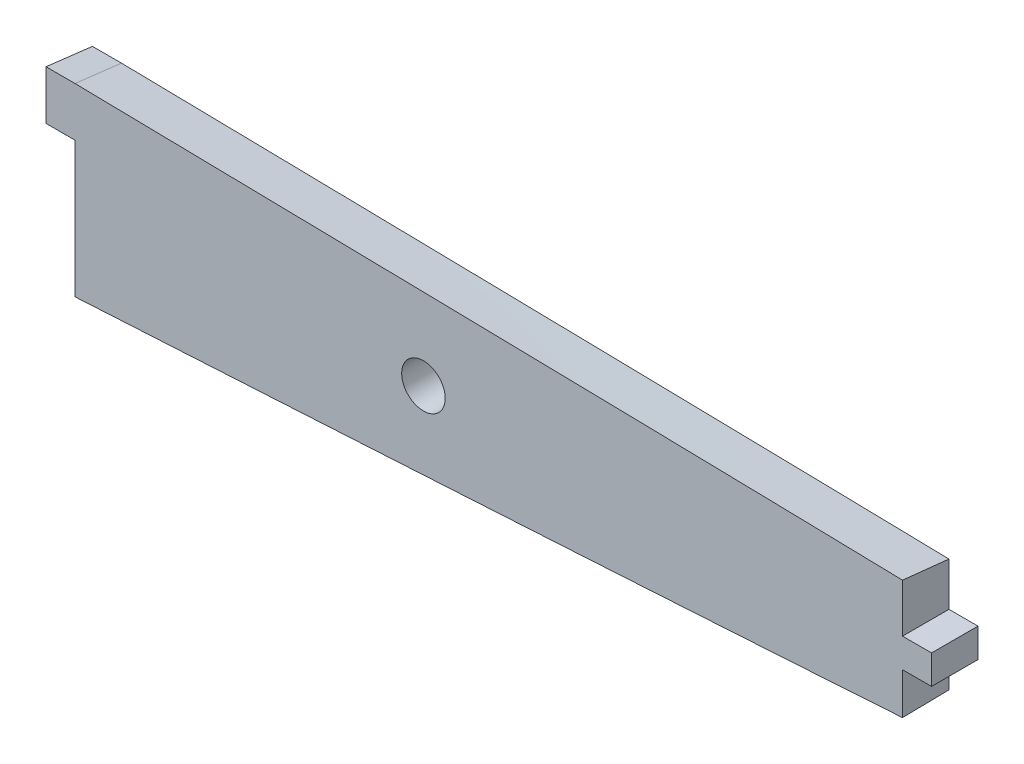
ISO-10303-21;
HEADER;
FILE_DESCRIPTION(('STEP AP214'),'2;1');
FILE_NAME('part.step','',(''),(''),'','','');
FILE_SCHEMA(('AUTOMOTIVE_DESIGN { 1 0 10303 214 1 1 1 1 }'));
ENDSEC;
DATA;
#1=APPLICATION_CONTEXT('core data for automotive mechanical design processes');
#2=APPLICATION_PROTOCOL_DEFINITION('international standard','automotive_design',2000,#1);
#3=PRODUCT_CONTEXT('',#1,'mechanical');
#4=PRODUCT('Part','Part','',(#3));
#5=PRODUCT_RELATED_PRODUCT_CATEGORY('part','',(#4));
#6=PRODUCT_DEFINITION_FORMATION('','',#4);
#7=PRODUCT_DEFINITION_CONTEXT('part definition',#1,'design');
#8=PRODUCT_DEFINITION('design','',#6,#7);
#9=PRODUCT_DEFINITION_SHAPE('','',#8);
#10=(LENGTH_UNIT() NAMED_UNIT(*) SI_UNIT(.MILLI.,.METRE.));
#11=(NAMED_UNIT(*) PLANE_ANGLE_UNIT() SI_UNIT($,.RADIAN.));
#12=(NAMED_UNIT(*) SI_UNIT($,.STERADIAN.) SOLID_ANGLE_UNIT());
#13=UNCERTAINTY_MEASURE_WITH_UNIT(LENGTH_MEASURE(1.E-05),#10,'distance_accuracy_value','');
#14=(GEOMETRIC_REPRESENTATION_CONTEXT(3) GLOBAL_UNCERTAINTY_ASSIGNED_CONTEXT((#13)) GLOBAL_UNIT_ASSIGNED_CONTEXT((#10,
#11,#12)) REPRESENTATION_CONTEXT('',''));
#15=CARTESIAN_POINT('',(0.,0.,0.));
#16=DIRECTION('',(0.,0.,1.));
#17=DIRECTION('',(1.,0.,0.));
#18=AXIS2_PLACEMENT_3D('',#15,#16,#17);
#19=CARTESIAN_POINT('',(0.,68.1685296686,5.08000000000001));
#20=DIRECTION('',(1.,0.,0.));
#21=DIRECTION('',(0.,0.,-1.));
#22=AXIS2_PLACEMENT_3D('',#19,#20,#21);
#23=PLANE('',#22);
#24=DIRECTION('',(0.,0.,1.));
#25=VECTOR('',#24,1.);
#26=CARTESIAN_POINT('',(0.,20.3824593467357,-5.07999999999997));
#27=LINE('',#26,#25);
#28=CARTESIAN_POINT('',(0.,20.3824593467356,-5.07999999999997));
#29=VERTEX_POINT('',#28);
#30=CARTESIAN_POINT('',(0.,20.3824593467355,5.07999999999986));
#31=VERTEX_POINT('',#30);
#32=EDGE_CURVE('E57',#29,#31,#27,.T.);
#33=ORIENTED_EDGE('',*,*,#32,.F.);
#34=DIRECTION('',(0.,-1.,0.));
#35=VECTOR('',#34,1.);
#36=CARTESIAN_POINT('',(0.,68.1685296686,-5.07999999999997));
#37=LINE('',#36,#35);
#38=CARTESIAN_POINT('',(0.,-8.9091186061851,-5.07999999999999));
#39=VERTEX_POINT('',#38);
#40=EDGE_CURVE('E130',#29,#39,#37,.T.);
#41=ORIENTED_EDGE('',*,*,#40,.T.);
#42=CARTESIAN_POINT('',(0.,-8.9091186061851,-5.08000000000001));
#43=CARTESIAN_POINT('',(0.,-9.100340278425,0.00828875850543073));
#44=CARTESIAN_POINT('',(0.,-9.28323172304783,5.07999999999983));
#45=B_SPLINE_CURVE_WITH_KNOTS('',2,(#42,#43,#44),.UNSPECIFIED.,.F.,.F.,(3,3),(0.,1.),.UNSPECIFIED.);
#46=CARTESIAN_POINT('',(0.,-9.28323172304783,5.07999999999992));
#47=VERTEX_POINT('',#46);
#48=EDGE_CURVE('E125',#39,#47,#45,.T.);
#49=ORIENTED_EDGE('',*,*,#48,.T.);
#50=DIRECTION('',(0.,-1.,0.));
#51=VECTOR('',#50,1.);
#52=CARTESIAN_POINT('',(0.,68.1685296686,5.08000000000001));
#53=LINE('',#52,#51);
#54=EDGE_CURVE('E122',#31,#47,#53,.T.);
#55=ORIENTED_EDGE('',*,*,#54,.F.);
#56=EDGE_LOOP('',(#33,#41,#49,#55));
#57=FACE_BOUND('',#56,.T.);
#58=ADVANCED_FACE('F36',(#57),#23,.F.);
#59=CARTESIAN_POINT('',(180.975,68.1685296686,5.08000000000006));
#60=DIRECTION('',(-1.,0.,0.));
#61=DIRECTION('',(0.,0.,1.));
#62=AXIS2_PLACEMENT_3D('',#59,#60,#61);
#63=PLANE('',#62);
#64=DIRECTION('',(0.,0.,1.));
#65=VECTOR('',#64,1.);
#66=CARTESIAN_POINT('',(180.975,16.9384284163652,5.07999999999863));
#67=LINE('',#66,#65);
#68=CARTESIAN_POINT('',(180.975,16.9384284163648,-5.08000000000006));
#69=VERTEX_POINT('',#68);
#70=CARTESIAN_POINT('',(180.975,16.9384284163648,5.08000000000006));
#71=VERTEX_POINT('',#70);
#72=EDGE_CURVE('E65',#69,#71,#67,.T.);
#73=ORIENTED_EDGE('',*,*,#72,.F.);
#74=DIRECTION('',(0.,-1.,0.));
#75=VECTOR('',#74,1.);
#76=CARTESIAN_POINT('',(180.975,68.1685296686,-5.08000000000006));
#77=LINE('',#76,#75);
#78=CARTESIAN_POINT('',(180.975,26.4634284163438,-5.08000000000006));
#79=VERTEX_POINT('',#78);
#80=EDGE_CURVE('E223',#79,#69,#77,.T.);
#81=ORIENTED_EDGE('',*,*,#80,.F.);
#82=CARTESIAN_POINT('',(180.975,27.5457610045795,5.08000000000007));
#83=CARTESIAN_POINT('',(180.975,27.4553730032048,4.23335396970068));
#84=CARTESIAN_POINT('',(180.975,27.3650457787327,3.38670145335956));
#85=CARTESIAN_POINT('',(180.975,27.1844942933383,1.69338545022722));
#86=CARTESIAN_POINT('',(180.975,27.0942700324148,0.846721963436123));
#87=CARTESIAN_POINT('',(180.975,26.9139058821622,-0.846613994891505));
#88=CARTESIAN_POINT('',(180.975,26.8237659928328,-1.69328646642802));
#89=CARTESIAN_POINT('',(180.975,26.6435522555936,-3.38663844667215));
#90=CARTESIAN_POINT('',(180.975,26.5534784076844,-4.23331795537983));
#91=CARTESIAN_POINT('',(180.975,26.4634284163438,-5.08000000000006));
#92=B_SPLINE_CURVE_WITH_KNOTS('',3,(#82,#83,#84,#85,#86,#87,#88,#89,#90,#91),.UNSPECIFIED.,.F.,
.F.,(4,2,2,2,4),(0.,2.55437181973439,5.10874361405029,7.66311540558675,10.2174872225417),.UNSPECIFIED.);
#93=CARTESIAN_POINT('',(180.975,27.5457610045795,5.08000000000006));
#94=VERTEX_POINT('',#93);
#95=EDGE_CURVE('E49',#94,#79,#92,.T.);
#96=ORIENTED_EDGE('',*,*,#95,.F.);
#97=DIRECTION('',(0.,-1.,0.));
#98=VECTOR('',#97,1.);
#99=CARTESIAN_POINT('',(180.975,68.1685296686,5.08000000000006));
#100=LINE('',#99,#98);
#101=EDGE_CURVE('E239',#94,#71,#100,.T.);
#102=ORIENTED_EDGE('',*,*,#101,.T.);
#103=EDGE_LOOP('',(#73,#81,#96,#102));
#104=FACE_BOUND('',#103,.T.);
#105=ADVANCED_FACE('F204',(#104),#63,.F.);
#106=DIRECTION('',(0.,0.,-1.));
#107=VECTOR('',#106,1.);
#108=CARTESIAN_POINT('',(180.975,10.5884284163652,5.07999999999921));
#109=LINE('',#108,#107);
#110=CARTESIAN_POINT('',(180.975,10.5884284163648,5.08000000000006));
#111=VERTEX_POINT('',#110);
#112=CARTESIAN_POINT('',(180.975,10.5884284163643,-5.08000000000083));
#113=VERTEX_POINT('',#112);
#114=EDGE_CURVE('E249',#111,#113,#109,.T.);
#115=ORIENTED_EDGE('',*,*,#114,.F.);
#116=CARTESIAN_POINT('',(180.975,1.50268763523809,5.08000000000005));
#117=VERTEX_POINT('',#116);
#118=EDGE_CURVE('E129',#111,#117,#100,.T.);
#119=ORIENTED_EDGE('',*,*,#118,.T.);
#120=CARTESIAN_POINT('',(180.975,1.67767318342592,-5.08000000000005));
#121=CARTESIAN_POINT('',(180.975,1.64653132812233,-3.38670072679886));
#122=CARTESIAN_POINT('',(180.975,1.61637827145488,-1.6933844235316));
#123=CARTESIAN_POINT('',(180.975,1.55804975539227,1.6932822431351));
#124=CARTESIAN_POINT('',(180.975,1.52987429599711,3.38663260653453));
#125=CARTESIAN_POINT('',(180.975,1.5026876352381,5.08000000000004));
#126=B_SPLINE_CURVE_WITH_KNOTS('',3,(#120,#121,#122,#123,#124,#125),.UNSPECIFIED.,.F.,.F.,(4,2,
4),(0.,5.08075425381252,10.161508507625),.UNSPECIFIED.);
#127=CARTESIAN_POINT('',(180.975,1.67767318342591,-5.08000000000005));
#128=VERTEX_POINT('',#127);
#129=EDGE_CURVE('E224',#128,#117,#126,.T.);
#130=ORIENTED_EDGE('',*,*,#129,.F.);
#131=EDGE_CURVE('E240',#113,#128,#77,.T.);
#132=ORIENTED_EDGE('',*,*,#131,.F.);
#133=EDGE_LOOP('',(#115,#119,#130,#132));
#134=FACE_BOUND('',#133,.T.);
#135=ADVANCED_FACE('F209',(#134),#63,.F.);
#136=CARTESIAN_POINT('',(0.,68.1685296686,5.08000000000001));
#137=DIRECTION('',(0.,0.,-1.));
#138=DIRECTION('',(-1.,0.,0.));
#139=AXIS2_PLACEMENT_3D('',#136,#137,#138);
#140=PLANE('',#139);
#141=CARTESIAN_POINT('',(76.2,11.9606935699889,5.08000000000003));
#142=DIRECTION('',(0.,0.,-1.));
#143=DIRECTION('',(-1.,0.,0.));
#144=AXIS2_PLACEMENT_3D('',#141,#142,#143);
#145=CIRCLE('',#144,4.76250000000001);
#146=CARTESIAN_POINT('',(71.4375,11.9606935699889,5.08000000000003));
#147=VERTEX_POINT('',#146);
#148=EDGE_CURVE('E146',#147,#147,#145,.F.);
#149=ORIENTED_EDGE('',*,*,#148,.F.);
#150=EDGE_LOOP('',(#149));
#151=FACE_BOUND('',#150,.T.);
#152=CARTESIAN_POINT('',(0.,31.1264588411048,5.08000000000002));
#153=CARTESIAN_POINT('',(7.540878598146,30.9915007529378,5.08000000000001));
#154=CARTESIAN_POINT('',(15.081745282566,30.8558698048851,5.08000000000001));
#155=CARTESIAN_POINT('',(30.1634467129071,30.5826941103659,5.08000000000003));
#156=CARTESIAN_POINT('',(37.7042814588156,30.4451493632016,5.08000000000004));
#157=CARTESIAN_POINT('',(52.7859055300961,30.1675780870469,5.08000000000003));
#158=CARTESIAN_POINT('',(60.3266948554674,30.0275515580145,5.08000000000002));
#159=CARTESIAN_POINT('',(71.637831258098,29.8150365208587,5.08000000000003));
#160=CARTESIAN_POINT('',(75.4082015924928,29.7437856448358,5.08000000000004));
#161=CARTESIAN_POINT('',(82.9489244022193,29.600330419434,5.08000000000002));
#162=CARTESIAN_POINT('',(86.7192768775498,29.5281260699865,5.08));
#163=CARTESIAN_POINT('',(95.516767514312,29.3583681854645,5.08));
#164=CARTESIAN_POINT('',(100.543897453606,29.2603877856525,5.08000000000003));
#165=CARTESIAN_POINT('',(110.598110561089,29.0620619339715,5.08000000000005));
#166=CARTESIAN_POINT('',(115.625193729279,28.9617164821885,5.08000000000004));
#167=CARTESIAN_POINT('',(125.679300891383,28.7581477626605,5.08000000000004));
#168=CARTESIAN_POINT('',(130.706324885308,28.6549244955037,5.08000000000006));
#169=CARTESIAN_POINT('',(140.760307894703,28.4449589930916,5.08000000000003));
#170=CARTESIAN_POINT('',(145.787266910051,28.3382167519671,5.07999999999999));
#171=CARTESIAN_POINT('',(155.84109255585,28.1204062016917,5.08000000000011));
#172=CARTESIAN_POINT('',(160.867959186284,28.0093378917542,5.08000000000027));
#173=CARTESIAN_POINT('',(170.92157553666,27.781834581265,5.07999999999984));
#174=CARTESIAN_POINT('',(175.948325256487,27.6653995756793,5.07999999999925));
#175=CARTESIAN_POINT('',(180.975,27.5457610045794,5.0799999999978));
#176=B_SPLINE_CURVE_WITH_KNOTS('',3,(#152,#153,#154,#155,#156,#157,#158,#159,#160,#161,#162,
#163,#164,#165,#166,#167,#168,#169,#170,#171,#172,#173,#174,#175),.UNSPECIFIED.,.F.,.F.,(4,2,2,
2,2,2,2,2,2,2,2,4),(0.,22.6262586494779,45.2525255484199,67.8787928307882,79.1919232579126,
90.5050544986673,105.589308081419,120.673561116489,135.757811068393,150.842086180281,
165.926364035267,181.010656039493),.UNSPECIFIED.);
#177=CARTESIAN_POINT('',(0.,31.1264588411048,5.08000000000002));
#178=VERTEX_POINT('',#177);
#179=EDGE_CURVE('E199',#178,#94,#176,.T.);
#180=ORIENTED_EDGE('',*,*,#179,.F.);
#181=DIRECTION('',(1.,0.,0.));
#182=VECTOR('',#181,1.);
#183=CARTESIAN_POINT('',(-21.1371270074686,31.1264588411048,5.08000000000002));
#184=LINE('',#183,#182);
#185=CARTESIAN_POINT('',(-6.35,31.1264588411048,5.08000000000002));
#186=VERTEX_POINT('',#185);
#187=EDGE_CURVE('E141',#186,#178,#184,.T.);
#188=ORIENTED_EDGE('',*,*,#187,.F.);
#189=DIRECTION('',(0.,-1.,0.));
#190=VECTOR('',#189,1.);
#191=CARTESIAN_POINT('',(-6.35,20.3824593467355,5.07999999999986));
#192=LINE('',#191,#190);
#193=CARTESIAN_POINT('',(-6.35,20.3824593467355,5.07999999999986));
#194=VERTEX_POINT('',#193);
#195=EDGE_CURVE('E137',#186,#194,#192,.T.);
#196=ORIENTED_EDGE('',*,*,#195,.T.);
#197=DIRECTION('',(1.,0.,0.));
#198=VECTOR('',#197,1.);
#199=CARTESIAN_POINT('',(-21.1371270074686,20.3824593467355,5.07999999999986));
#200=LINE('',#199,#198);
#201=EDGE_CURVE('E134',#194,#31,#200,.T.);
#202=ORIENTED_EDGE('',*,*,#201,.T.);
#203=ORIENTED_EDGE('',*,*,#54,.T.);
#204=CARTESIAN_POINT('',(0.,-9.28323172304784,5.08000000000001));
#205=CARTESIAN_POINT('',(7.54204521171787,-8.85911107441002,5.08000000000004));
#206=CARTESIAN_POINT('',(15.0839979535319,-8.43333860801259,5.08000000000003));
#207=CARTESIAN_POINT('',(30.1676750102591,-7.57765754531917,5.08));
#208=CARTESIAN_POINT('',(37.7093993249771,-7.1477489455862,5.07999999999998));
#209=CARTESIAN_POINT('',(52.7925639955184,-6.28296379586194,5.07999999999998));
#210=CARTESIAN_POINT('',(60.3340043513232,-5.84808724554745,5.08000000000002));
#211=CARTESIAN_POINT('',(71.6458965346627,-5.19119198938416,5.08000000000004));
#212=CARTESIAN_POINT('',(75.4164814070682,-4.97146356543832,5.08000000000004));
#213=CARTESIAN_POINT('',(82.9575522598697,-4.53030672419307,5.08000000000003));
#214=CARTESIAN_POINT('',(86.7280382402518,-4.30887830665409,5.08000000000001));
#215=CARTESIAN_POINT('',(95.5257872214362,-3.79000103858775,5.08000000000001));
#216=CARTESIAN_POINT('',(100.553006880389,-3.49181668966135,5.08000000000003));
#217=CARTESIAN_POINT('',(110.607213553098,-2.89155279527505,5.08000000000005));
#218=CARTESIAN_POINT('',(115.634200566864,-2.58947324998636,5.08000000000004));
#219=CARTESIAN_POINT('',(125.687898655516,-1.98078187839749,5.08000000000004));
#220=CARTESIAN_POINT('',(130.714609730498,-1.67417005368462,5.08000000000005));
#221=CARTESIAN_POINT('',(140.767724732615,-1.05565133700586,5.08000000000004));
#222=CARTESIAN_POINT('',(145.794128658562,-0.743744425730248,5.08000000000002));
#223=CARTESIAN_POINT('',(155.846551133154,-0.113744507681252,5.08000000000008));
#224=CARTESIAN_POINT('',(160.872569681669,0.204348501163069,5.08000000000017));
#225=CARTESIAN_POINT('',(170.9241494129,0.847799660625839,5.07999999999994));
#226=CARTESIAN_POINT('',(175.949710594881,1.17315782272172,5.07999999999962));
#227=CARTESIAN_POINT('',(180.975,1.50268763523811,5.07999999999884));
#228=B_SPLINE_CURVE_WITH_KNOTS('',3,(#204,#205,#206,#207,#208,#209,#210,#211,#212,#213,#214,
#215,#216,#217,#218,#219,#220,#221,#222,#223,#224,#225,#226,#227),.UNSPECIFIED.,.F.,.F.,(4,2,2,
2,2,2,2,2,2,2,2,4),(0.,22.6618829207635,45.3237846743184,67.9856879022546,79.316632722599,
90.6475791396908,105.755743234119,120.863906664476,135.972064803741,151.080278050144,
166.188496354463,181.296738528319),.UNSPECIFIED.);
#229=EDGE_CURVE('E255',#47,#117,#228,.T.);
#230=ORIENTED_EDGE('',*,*,#229,.T.);
#231=ORIENTED_EDGE('',*,*,#118,.F.);
#232=DIRECTION('',(-1.,0.,0.));
#233=VECTOR('',#232,1.);
#234=CARTESIAN_POINT('',(199.306156037713,10.5884284163652,5.07999999999921));
#235=LINE('',#234,#233);
#236=CARTESIAN_POINT('',(187.325,10.5884284163652,5.07999999999921));
#237=VERTEX_POINT('',#236);
#238=EDGE_CURVE('E440',#237,#111,#235,.T.);
#239=ORIENTED_EDGE('',*,*,#238,.F.);
#240=DIRECTION('',(0.,-1.,0.));
#241=VECTOR('',#240,1.);
#242=CARTESIAN_POINT('',(187.325,16.9384284163652,5.07999999999863));
#243=LINE('',#242,#241);
#244=CARTESIAN_POINT('',(187.325,16.9384284163652,5.07999999999863));
#245=VERTEX_POINT('',#244);
#246=EDGE_CURVE('E456',#245,#237,#243,.T.);
#247=ORIENTED_EDGE('',*,*,#246,.F.);
#248=DIRECTION('',(-1.,0.,0.));
#249=VECTOR('',#248,1.);
#250=CARTESIAN_POINT('',(199.306156037713,16.9384284163652,5.07999999999863));
#251=LINE('',#250,#249);
#252=EDGE_CURVE('E435',#245,#71,#251,.T.);
#253=ORIENTED_EDGE('',*,*,#252,.T.);
#254=ORIENTED_EDGE('',*,*,#101,.F.);
#255=EDGE_LOOP('',(#180,#188,#196,#202,#203,#230,#231,#239,#247,#253,#254));
#256=FACE_BOUND('',#255,.T.);
#257=ADVANCED_FACE('F135',(#151,#256),#140,.F.);
#258=CARTESIAN_POINT('',(0.,68.1685296686,-5.07999999999997));
#259=DIRECTION('',(0.,0.,1.));
#260=DIRECTION('',(1.,0.,0.));
#261=AXIS2_PLACEMENT_3D('',#258,#259,#260);
#262=PLANE('',#261);
#263=CARTESIAN_POINT('',(76.2,11.9606935699889,-5.08));
#264=DIRECTION('',(0.,0.,-1.));
#265=DIRECTION('',(-1.,0.,0.));
#266=AXIS2_PLACEMENT_3D('',#263,#264,#265);
#267=CIRCLE('',#266,4.76250000000001);
#268=CARTESIAN_POINT('',(71.4375,11.9606935699889,-5.08));
#269=VERTEX_POINT('',#268);
#270=EDGE_CURVE('E151',#269,#269,#267,.T.);
#271=ORIENTED_EDGE('',*,*,#270,.F.);
#272=EDGE_LOOP('',(#271));
#273=FACE_BOUND('',#272,.T.);
#274=CARTESIAN_POINT('',(180.975,26.4634284163438,-5.08000000000006));
#275=CARTESIAN_POINT('',(176.861288744215,26.5528301722815,-5.08000000000006));
#276=CARTESIAN_POINT('',(172.747545793579,26.6407599051557,-5.08000000000005));
#277=CARTESIAN_POINT('',(164.520007188514,26.8140969797346,-5.08000000000005));
#278=CARTESIAN_POINT('',(160.406211534091,26.8995043217341,-5.08000000000004));
#279=CARTESIAN_POINT('',(152.178579347824,27.0682182471171,-5.08000000000004));
#280=CARTESIAN_POINT('',(148.064742816003,27.151524831574,-5.08000000000005));
#281=CARTESIAN_POINT('',(139.837034063824,27.3163614696467,-5.08000000000003));
#282=CARTESIAN_POINT('',(135.723161843465,27.397891523203,-5.08000000000001));
#283=CARTESIAN_POINT('',(123.381505515301,27.6402430379542,-5.07999999999998));
#284=CARTESIAN_POINT('',(115.153677455265,27.7988259404883,-5.08));
#285=CARTESIAN_POINT('',(98.6979380209043,28.1117098225093,-5.08000000000004));
#286=CARTESIAN_POINT('',(90.4700266465566,28.2660108008205,-5.08000000000005));
#287=CARTESIAN_POINT('',(75.3886347910034,28.545978357519,-5.08000000000004));
#288=CARTESIAN_POINT('',(68.5351631578599,28.6721224038424,-5.08000000000001));
#289=CARTESIAN_POINT('',(54.8281893168122,28.9227415474247,-5.07999999999998));
#290=CARTESIAN_POINT('',(47.9746871089077,29.0472166446614,-5.07999999999999));
#291=CARTESIAN_POINT('',(34.2676640365372,29.2948830815499,-5.07999999999999));
#292=CARTESIAN_POINT('',(27.4141431720866,29.4180744220467,-5.07999999999998));
#293=CARTESIAN_POINT('',(13.7070836797305,29.663451533301,-5.07999999999997));
#294=CARTESIAN_POINT('',(6.85354505182572,29.7856373040944,-5.07999999999997));
#295=CARTESIAN_POINT('',(0.,29.9074593467357,-5.07999999999996));
#296=B_SPLINE_CURVE_WITH_KNOTS('',3,(#274,#275,#276,#277,#278,#279,#280,#281,#282,#283,#284,
#285,#286,#287,#288,#289,#290,#291,#292,#293,#294,#295),.UNSPECIFIED.,.F.,.F.,(4,2,2,2,2,2,2,2,
2,2,4),(0.,12.3440471339799,24.6880928257615,37.032132211091,49.3761720098245,74.0642387492005,
98.7523122667729,119.316209304779,139.880106614286,160.443990387034,181.007873426194),.UNSPECIFIED.);
#297=CARTESIAN_POINT('',(0.,29.9074593467357,-5.07999999999997));
#298=VERTEX_POINT('',#297);
#299=EDGE_CURVE('E11',#79,#298,#296,.T.);
#300=ORIENTED_EDGE('',*,*,#299,.F.);
#301=ORIENTED_EDGE('',*,*,#80,.T.);
#302=DIRECTION('',(-1.,0.,0.));
#303=VECTOR('',#302,1.);
#304=CARTESIAN_POINT('',(199.306156037713,16.9384284163643,-5.08000000000139));
#305=LINE('',#304,#303);
#306=CARTESIAN_POINT('',(187.325,16.9384284163643,-5.08000000000139));
#307=VERTEX_POINT('',#306);
#308=EDGE_CURVE('E176',#307,#69,#305,.T.);
#309=ORIENTED_EDGE('',*,*,#308,.F.);
#310=DIRECTION('',(0.,1.,0.));
#311=VECTOR('',#310,1.);
#312=CARTESIAN_POINT('',(187.325,10.5884284163643,-5.08000000000083));
#313=LINE('',#312,#311);
#314=CARTESIAN_POINT('',(187.325,10.5884284163643,-5.08000000000083));
#315=VERTEX_POINT('',#314);
#316=EDGE_CURVE('E258',#315,#307,#313,.T.);
#317=ORIENTED_EDGE('',*,*,#316,.F.);
#318=DIRECTION('',(-1.,0.,0.));
#319=VECTOR('',#318,1.);
#320=CARTESIAN_POINT('',(199.306156037713,10.5884284163643,-5.08000000000083));
#321=LINE('',#320,#319);
#322=EDGE_CURVE('E181',#315,#113,#321,.T.);
#323=ORIENTED_EDGE('',*,*,#322,.T.);
#324=ORIENTED_EDGE('',*,*,#131,.T.);
#325=CARTESIAN_POINT('',(180.975,1.67767318342592,-5.08000000000005));
#326=CARTESIAN_POINT('',(175.949540454974,1.35735073760627,-5.08000000000005));
#327=CARTESIAN_POINT('',(170.923841051549,1.04081616620861,-5.08000000000005));
#328=CARTESIAN_POINT('',(160.872042758774,0.414256340321322,-5.08000000000005));
#329=CARTESIAN_POINT('',(155.845943869947,0.104231077457531,-5.08000000000004));
#330=CARTESIAN_POINT('',(145.793415230545,-0.51037730103878,-5.08000000000004));
#331=CARTESIAN_POINT('',(140.766985480058,-0.814960418105779,-5.08000000000004));
#332=CARTESIAN_POINT('',(130.713862990683,-1.4195177331825,-5.08000000000003));
#333=CARTESIAN_POINT('',(125.687170252564,-1.71949194397887,-5.08000000000003));
#334=CARTESIAN_POINT('',(115.633551757485,-2.31553104095315,-5.08000000000002));
#335=CARTESIAN_POINT('',(110.60662600046,-2.61159592602057,-5.08000000000001));
#336=CARTESIAN_POINT('',(100.552578966955,-3.20038872464224,-5.08000000000003));
#337=CARTESIAN_POINT('',(95.5254576904676,-3.49311663806639,-5.08000000000005));
#338=CARTESIAN_POINT('',(86.7277787466528,-4.00288819136693,-5.08000000000004));
#339=CARTESIAN_POINT('',(82.9572573585865,-4.22055841143872,-5.08000000000002));
#340=CARTESIAN_POINT('',(75.4161319548203,-4.65445517924708,-5.07999999999999));
#341=CARTESIAN_POINT('',(71.6455279391295,-4.87068172714357,-5.08));
#342=CARTESIAN_POINT('',(60.333601540833,-5.51742266902181,-5.08000000000001));
#343=CARTESIAN_POINT('',(52.7921682736793,-5.94599816060606,-5.08000000000002));
#344=CARTESIAN_POINT('',(37.709053567068,-6.79896470257326,-5.08000000000001));
#345=CARTESIAN_POINT('',(30.1673721272412,-7.22335574642069,-5.07999999999998));
#346=CARTESIAN_POINT('',(15.0838192931408,-8.06866429717433,-5.07999999999997));
#347=CARTESIAN_POINT('',(7.54194789898976,-8.48958180626742,-5.07999999999998));
#348=CARTESIAN_POINT('',(0.,-8.90911860618509,-5.08000000000005));
#349=B_SPLINE_CURVE_WITH_KNOTS('',3,(#325,#326,#327,#328,#329,#330,#331,#332,#333,#334,#335,
#336,#337,#338,#339,#340,#341,#342,#343,#344,#345,#346,#347,#348),.UNSPECIFIED.,.F.,.F.,(4,2,2,
2,2,2,2,2,2,2,2,4),(0.,15.1069698766817,30.2139203172093,45.3208667756819,60.4277713148731,
75.5346801453313,90.6415895648131,101.971986747143,113.302382674256,135.963184945905,
158.624022604903,181.284845996009),.UNSPECIFIED.);
#350=EDGE_CURVE('E257',#128,#39,#349,.T.);
#351=ORIENTED_EDGE('',*,*,#350,.T.);
#352=ORIENTED_EDGE('',*,*,#40,.F.);
#353=DIRECTION('',(1.,0.,0.));
#354=VECTOR('',#353,1.);
#355=CARTESIAN_POINT('',(-21.1371270074686,20.3824593467357,-5.07999999999997));
#356=LINE('',#355,#354);
#357=CARTESIAN_POINT('',(-6.35,20.3824593467357,-5.07999999999997));
#358=VERTEX_POINT('',#357);
#359=EDGE_CURVE('E140',#358,#29,#356,.T.);
#360=ORIENTED_EDGE('',*,*,#359,.F.);
#361=DIRECTION('',(0.,1.,0.));
#362=VECTOR('',#361,1.);
#363=CARTESIAN_POINT('',(-6.35,29.9074593467357,-5.07999999999997));
#364=LINE('',#363,#362);
#365=CARTESIAN_POINT('',(-6.35,29.9074593467357,-5.07999999999997));
#366=VERTEX_POINT('',#365);
#367=EDGE_CURVE('E429',#358,#366,#364,.T.);
#368=ORIENTED_EDGE('',*,*,#367,.T.);
#369=DIRECTION('',(1.,0.,0.));
#370=VECTOR('',#369,1.);
#371=CARTESIAN_POINT('',(-21.1371270074686,29.9074593467357,-5.07999999999997));
#372=LINE('',#371,#370);
#373=EDGE_CURVE('E163',#366,#298,#372,.T.);
#374=ORIENTED_EDGE('',*,*,#373,.T.);
#375=EDGE_LOOP('',(#300,#301,#309,#317,#323,#324,#351,#352,#360,#368,#374));
#376=FACE_BOUND('',#375,.T.);
#377=ADVANCED_FACE('F210',(#273,#376),#262,.F.);
#378=CARTESIAN_POINT('',(0.,3.76640621989611,-241.3));
#379=CARTESIAN_POINT('',(180.975,8.69313035782715,-164.333003978403));
#380=CARTESIAN_POINT('',(0.,13.1710087068932,-169.512198054911));
#381=CARTESIAN_POINT('',(180.975,13.8921825252803,-119.662610613001));
#382=CARTESIAN_POINT('',(0.,21.0550575782133,-78.8082599981825));
#383=CARTESIAN_POINT('',(180.975,19.33371338101,-72.3769229623819));
#384=CARTESIAN_POINT('',(0.,37.1235261113863,55.6101587487718));
#385=CARTESIAN_POINT('',(180.975,28.6507060178125,15.6276355346142));
#386=CARTESIAN_POINT('',(0.,48.7977663222177,129.426856504391));
#387=CARTESIAN_POINT('',(180.975,33.9284348276645,64.5497023457835));
#388=CARTESIAN_POINT('',(0.,57.5998085231161,198.009320440341));
#389=CARTESIAN_POINT('',(180.975,38.0813427594087,95.1955572914661));
#390=CARTESIAN_POINT('',(0.,62.9543851616648,247.036281870022));
#391=CARTESIAN_POINT('',(180.975,40.072039815151,117.202001979545));
#392=CARTESIAN_POINT('',(0.,66.1525245092423,291.989522693939));
#393=CARTESIAN_POINT('',(180.975,41.1499185194115,137.241930839791));
#394=CARTESIAN_POINT('',(0.,68.1675296686,352.543352943217));
#395=CARTESIAN_POINT('',(180.975,43.3111951964629,164.012369139284));
#396=CARTESIAN_POINT('',(0.,67.7183696879014,410.109595972467));
#397=CARTESIAN_POINT('',(180.975,43.8548371209846,189.230485440772));
#398=CARTESIAN_POINT('',(0.,63.2094386266616,467.82184250888));
#399=CARTESIAN_POINT('',(180.975,40.1916457914026,215.197160236647));
#400=CARTESIAN_POINT('',(0.,57.956184881224,507.350823143271));
#401=CARTESIAN_POINT('',(180.975,36.7387215138955,233.332717966986));
#402=CARTESIAN_POINT('',(0.,54.7487461076087,526.308273351952));
#403=CARTESIAN_POINT('',(180.975,34.8156235896686,242.201701799802));
#404=CARTESIAN_POINT('',(0.,50.2039147105371,546.352546318645));
#405=CARTESIAN_POINT('',(180.975,32.6078504037563,251.794049093099));
#406=CARTESIAN_POINT('',(0.,44.0113074578187,566.914559376086));
#407=CARTESIAN_POINT('',(180.975,30.0023301395098,261.857755720266));
#408=CARTESIAN_POINT('',(0.,31.2937438611368,594.054164436425));
#409=CARTESIAN_POINT('',(180.975,23.0591377393112,275.21582052234));
#410=CARTESIAN_POINT('',(0.,19.9797534020256,609.754137799728));
#411=CARTESIAN_POINT('',(180.975,16.9218526728062,283.327395290058));
#412=CARTESIAN_POINT('',(0.,13.2914062198966,617.022547788667));
#413=CARTESIAN_POINT('',(180.975,13.2914062198966,287.066868946793));
#414=B_SPLINE_SURFACE_WITH_KNOTS('',3,1,((#378,#379),(#380,#381),(#382,#383),(#384,#385),(#386,
#387),(#388,#389),(#390,#391),(#392,#393),(#394,#395),(#396,#397),(#398,#399),(#400,#401),(#402,
#403),(#404,#405),(#406,#407),(#408,#409),(#410,#411),(#412,#413)),.UNSPECIFIED.,.F.,.F.,.F.,(4,
1,1,1,1,1,1,1,1,1,1,1,1,1,1,4),(2,2),(0.,0.247403676163197,0.308401542794999,0.462108507234246,
0.504395117820794,0.542913331738732,0.627983171442133,0.653401948280027,0.743134379497065,
0.818760812058344,0.850169972641487,0.882434425471212,0.887176210845698,0.924179621726545,
0.960505119713505,1.),(0.,1.),.UNSPECIFIED.);
#415=CARTESIAN_POINT('',(0.,31.1264588411048,5.08000000000003));
#416=CARTESIAN_POINT('',(0.,31.0234962481061,4.23349930580334));
#417=CARTESIAN_POINT('',(0.,30.9208895962421,3.38695533199301));
#418=CARTESIAN_POINT('',(0.,30.7163715506977,1.69378395349765));
#419=CARTESIAN_POINT('',(0.,30.6144601565709,0.847156548866551));
#420=CARTESIAN_POINT('',(0.,30.4113158710111,-0.846179643515562));
#421=CARTESIAN_POINT('',(0.,30.3100829795728,-1.69288843126593));
#422=CARTESIAN_POINT('',(0.,30.1082789761446,-3.38638542084281));
#423=CARTESIAN_POINT('',(0.,30.0077078645798,-4.23317362271998));
#424=CARTESIAN_POINT('',(0.,29.9074593467357,-5.07999999999996));
#425=B_SPLINE_CURVE_WITH_KNOTS('',3,(#415,#416,#417,#418,#419,#420,#421,#422,#423,#424),
.UNSPECIFIED.,.F.,.F.,(4,2,2,2,4),(0.,2.55821851976493,5.11643539656185,7.67465225309253,
10.2328707525912),.UNSPECIFIED.);
#426=EDGE_CURVE('E185',#178,#298,#425,.T.);
#427=ORIENTED_EDGE('',*,*,#426,.F.);
#428=ORIENTED_EDGE('',*,*,#179,.T.);
#429=ORIENTED_EDGE('',*,*,#95,.T.);
#430=ORIENTED_EDGE('',*,*,#299,.T.);
#431=EDGE_LOOP('',(#427,#428,#429,#430));
#432=FACE_BOUND('',#431,.T.);
#433=ADVANCED_FACE('F38',(#432),#414,.T.);
#434=CARTESIAN_POINT('',(0.,13.2914062198968,617.022547788667));
#435=CARTESIAN_POINT('',(180.975,13.2914062198967,287.066868946793));
#436=CARTESIAN_POINT('',(0.,-1.6346618460275,579.732083241401));
#437=CARTESIAN_POINT('',(180.975,7.90414132716936,266.665101534965));
#438=CARTESIAN_POINT('',(0.,-7.63985071848049,493.124189486326));
#439=CARTESIAN_POINT('',(180.975,0.681716153609975,218.41528803322));
#440=CARTESIAN_POINT('',(0.,-11.5456493437354,383.35644074039));
#441=CARTESIAN_POINT('',(180.975,0.694296632013353,161.799137472671));
#442=CARTESIAN_POINT('',(0.,-15.7692195959272,130.463845401109));
#443=CARTESIAN_POINT('',(180.975,0.769058525041147,31.7030236612414));
#444=CARTESIAN_POINT('',(0.,-8.62268129918264,-59.4070577204985));
#445=CARTESIAN_POINT('',(180.975,1.49966506495164,-70.1666512266198));
#446=CARTESIAN_POINT('',(0.,3.76640621989611,-241.3));
#447=CARTESIAN_POINT('',(180.975,8.69313035782715,-164.333003978403));
#448=B_SPLINE_SURFACE_WITH_KNOTS('',3,1,((#434,#435),(#436,#437),(#438,#439),(#440,#441),(#442,
#443),(#444,#445),(#446,#447)),.UNSPECIFIED.,.F.,.F.,.F.,(4,1,1,1,4),(2,2),(0.,
0.138221334267563,0.3235363097206,0.374686955614901,1.),(0.,1.),.UNSPECIFIED.);
#449=ORIENTED_EDGE('',*,*,#350,.F.);
#450=ORIENTED_EDGE('',*,*,#129,.T.);
#451=ORIENTED_EDGE('',*,*,#229,.F.);
#452=ORIENTED_EDGE('',*,*,#48,.F.);
#453=EDGE_LOOP('',(#449,#450,#451,#452));
#454=FACE_BOUND('',#453,.T.);
#455=ADVANCED_FACE('F254',(#454),#448,.T.);
#456=CARTESIAN_POINT('',(199.306156037713,10.5884284163652,5.07999999999921));
#457=DIRECTION('',(0.,1.,0.));
#458=DIRECTION('',(0.,0.,1.));
#459=AXIS2_PLACEMENT_3D('',#456,#457,#458);
#460=PLANE('',#459);
#461=DIRECTION('',(0.,0.,-1.));
#462=VECTOR('',#461,1.);
#463=CARTESIAN_POINT('',(187.325,10.5884284163652,5.07999999999921));
#464=LINE('',#463,#462);
#465=EDGE_CURVE('E458',#237,#315,#464,.T.);
#466=ORIENTED_EDGE('',*,*,#465,.F.);
#467=ORIENTED_EDGE('',*,*,#238,.T.);
#468=ORIENTED_EDGE('',*,*,#114,.T.);
#469=ORIENTED_EDGE('',*,*,#322,.F.);
#470=EDGE_LOOP('',(#466,#467,#468,#469));
#471=FACE_BOUND('',#470,.T.);
#472=ADVANCED_FACE('F279',(#471),#460,.F.);
#473=CARTESIAN_POINT('',(199.306156037713,16.9384284163652,5.07999999999863));
#474=DIRECTION('',(0.,-1.,0.));
#475=DIRECTION('',(0.,0.,-1.));
#476=AXIS2_PLACEMENT_3D('',#473,#474,#475);
#477=PLANE('',#476);
#478=DIRECTION('',(0.,0.,1.));
#479=VECTOR('',#478,1.);
#480=CARTESIAN_POINT('',(187.325,16.9384284163652,5.07999999999863));
#481=LINE('',#480,#479);
#482=EDGE_CURVE('E175',#307,#245,#481,.T.);
#483=ORIENTED_EDGE('',*,*,#482,.F.);
#484=ORIENTED_EDGE('',*,*,#308,.T.);
#485=ORIENTED_EDGE('',*,*,#72,.T.);
#486=ORIENTED_EDGE('',*,*,#252,.F.);
#487=EDGE_LOOP('',(#483,#484,#485,#486));
#488=FACE_BOUND('',#487,.T.);
#489=ADVANCED_FACE('F292',(#488),#477,.F.);
#490=CARTESIAN_POINT('',(187.325,0.900951429124184,61.6633497114729));
#491=DIRECTION('',(1.,0.,0.));
#492=DIRECTION('',(0.,0.,-1.));
#493=AXIS2_PLACEMENT_3D('',#490,#491,#492);
#494=PLANE('',#493);
#495=ORIENTED_EDGE('',*,*,#482,.T.);
#496=ORIENTED_EDGE('',*,*,#246,.T.);
#497=ORIENTED_EDGE('',*,*,#465,.T.);
#498=ORIENTED_EDGE('',*,*,#316,.T.);
#499=EDGE_LOOP('',(#495,#496,#497,#498));
#500=FACE_BOUND('',#499,.T.);
#501=ADVANCED_FACE('F280',(#500),#494,.T.);
#502=CARTESIAN_POINT('',(-21.1371270074686,20.3824593467357,-5.07999999999997));
#503=DIRECTION('',(0.,1.,0.));
#504=DIRECTION('',(0.,0.,1.));
#505=AXIS2_PLACEMENT_3D('',#502,#503,#504);
#506=PLANE('',#505);
#507=ORIENTED_EDGE('',*,*,#201,.F.);
#508=DIRECTION('',(0.,0.,-1.));
#509=VECTOR('',#508,1.);
#510=CARTESIAN_POINT('',(-6.35,20.3824593467357,-5.07999999999997));
#511=LINE('',#510,#509);
#512=EDGE_CURVE('E167',#194,#358,#511,.T.);
#513=ORIENTED_EDGE('',*,*,#512,.T.);
#514=ORIENTED_EDGE('',*,*,#359,.T.);
#515=ORIENTED_EDGE('',*,*,#32,.T.);
#516=EDGE_LOOP('',(#507,#513,#514,#515));
#517=FACE_BOUND('',#516,.T.);
#518=ADVANCED_FACE('F144',(#517),#506,.F.);
#519=CARTESIAN_POINT('',(-21.1371270074686,31.1264588411048,5.08000000000002));
#520=CARTESIAN_POINT('',(-21.1371270074686,30.7147534493723,1.6951893185686));
#521=CARTESIAN_POINT('',(-21.1371270074686,30.3085908353275,-1.69153354386451));
#522=CARTESIAN_POINT('',(-21.1371270074686,29.9074593467357,-5.07999999999997));
#523=B_SPLINE_CURVE_WITH_KNOTS('',3,(#519,#520,#521,#522),.UNSPECIFIED.,.F.,.F.,(4,4),
(0.269771877436496,0.281416192604098),.UNSPECIFIED.);
#524=DIRECTION('',(1.,0.,0.));
#525=VECTOR('',#524,1.);
#526=SURFACE_OF_LINEAR_EXTRUSION('',#523,#525);
#527=ORIENTED_EDGE('',*,*,#373,.F.);
#528=CARTESIAN_POINT('',(-6.35000000000002,31.1264588411048,5.08000000000002));
#529=CARTESIAN_POINT('',(-6.35000000000002,30.7147534493723,1.6951893185686));
#530=CARTESIAN_POINT('',(-6.35000000000002,30.3085908353275,-1.69153354386451));
#531=CARTESIAN_POINT('',(-6.35000000000002,29.9074593467357,-5.07999999999997));
#532=B_SPLINE_CURVE_WITH_KNOTS('',3,(#528,#529,#530,#531),.UNSPECIFIED.,.F.,.F.,(4,4),
(0.269771877436496,0.281416192604098),.UNSPECIFIED.);
#533=EDGE_CURVE('E431',#366,#186,#532,.F.);
#534=ORIENTED_EDGE('',*,*,#533,.T.);
#535=ORIENTED_EDGE('',*,*,#187,.T.);
#536=ORIENTED_EDGE('',*,*,#426,.T.);
#537=EDGE_LOOP('',(#527,#534,#535,#536));
#538=FACE_BOUND('',#537,.T.);
#539=ADVANCED_FACE('F300',(#538),#526,.F.);
#540=CARTESIAN_POINT('',(-6.35,-13.2466380621064,189.824533969966));
#541=DIRECTION('',(1.,0.,0.));
#542=DIRECTION('',(0.,0.,-1.));
#543=AXIS2_PLACEMENT_3D('',#540,#541,#542);
#544=PLANE('',#543);
#545=ORIENTED_EDGE('',*,*,#367,.F.);
#546=ORIENTED_EDGE('',*,*,#512,.F.);
#547=ORIENTED_EDGE('',*,*,#195,.F.);
#548=ORIENTED_EDGE('',*,*,#533,.F.);
#549=EDGE_LOOP('',(#545,#546,#547,#548));
#550=FACE_BOUND('',#549,.T.);
#551=ADVANCED_FACE('F303',(#550),#544,.F.);
#552=CARTESIAN_POINT('',(76.2,11.9606935699889,5.08105000000011));
#553=DIRECTION('',(0.,0.,-1.));
#554=DIRECTION('',(-1.,0.,0.));
#555=AXIS2_PLACEMENT_3D('',#552,#553,#554);
#556=CYLINDRICAL_SURFACE('',#555,4.76250000000001);
#557=ORIENTED_EDGE('',*,*,#270,.T.);
#558=EDGE_LOOP('',(#557));
#559=FACE_BOUND('',#558,.T.);
#560=ORIENTED_EDGE('',*,*,#148,.T.);
#561=EDGE_LOOP('',(#560));
#562=FACE_BOUND('',#561,.T.);
#563=ADVANCED_FACE('F309',(#559,#562),#556,.F.);
#564=CLOSED_SHELL('',(#58,#105,#135,#257,#377,#433,#455,#472,#489,#501,#518,#539,#551,#563));
#565=MANIFOLD_SOLID_BREP('B2',#564);
#566=ADVANCED_BREP_SHAPE_REPRESENTATION('',(#18,#565),#14);
#567=SHAPE_DEFINITION_REPRESENTATION(#9,#566);
ENDSEC;
END-ISO-10303-21;
